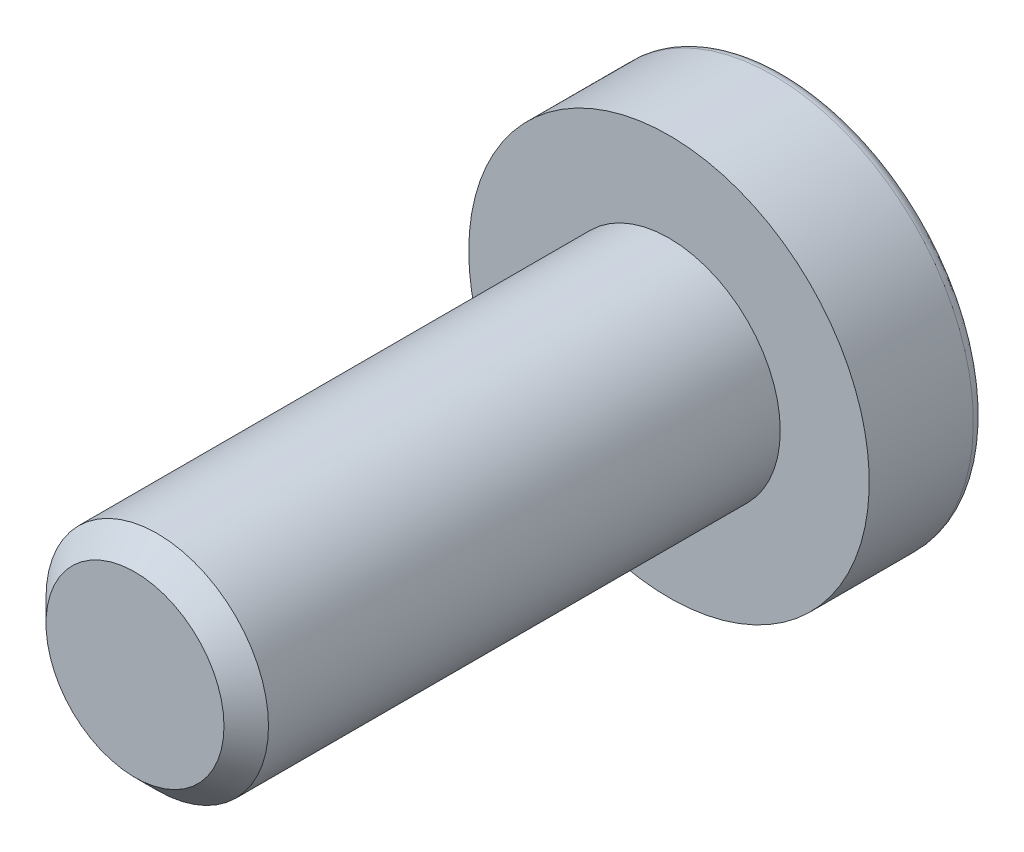
ISO-10303-21;
HEADER;
FILE_DESCRIPTION(('STEP AP214'),'2;1');
FILE_NAME('part.step','',(''),(''),'','','');
FILE_SCHEMA(('AUTOMOTIVE_DESIGN { 1 0 10303 214 1 1 1 1 }'));
ENDSEC;
DATA;
#1=APPLICATION_CONTEXT('core data for automotive mechanical design processes');
#2=APPLICATION_PROTOCOL_DEFINITION('international standard','automotive_design',2000,#1);
#3=PRODUCT_CONTEXT('',#1,'mechanical');
#4=PRODUCT('Part','Part','',(#3));
#5=PRODUCT_RELATED_PRODUCT_CATEGORY('part','',(#4));
#6=PRODUCT_DEFINITION_FORMATION('','',#4);
#7=PRODUCT_DEFINITION_CONTEXT('part definition',#1,'design');
#8=PRODUCT_DEFINITION('design','',#6,#7);
#9=PRODUCT_DEFINITION_SHAPE('','',#8);
#10=(LENGTH_UNIT() NAMED_UNIT(*) SI_UNIT(.MILLI.,.METRE.));
#11=(NAMED_UNIT(*) PLANE_ANGLE_UNIT() SI_UNIT($,.RADIAN.));
#12=(NAMED_UNIT(*) SI_UNIT($,.STERADIAN.) SOLID_ANGLE_UNIT());
#13=UNCERTAINTY_MEASURE_WITH_UNIT(LENGTH_MEASURE(1.E-05),#10,'distance_accuracy_value','');
#14=(GEOMETRIC_REPRESENTATION_CONTEXT(3) GLOBAL_UNCERTAINTY_ASSIGNED_CONTEXT((#13)) GLOBAL_UNIT_ASSIGNED_CONTEXT((#10,
#11,#12)) REPRESENTATION_CONTEXT('',''));
#15=CARTESIAN_POINT('',(0.,0.,0.));
#16=DIRECTION('',(0.,0.,1.));
#17=DIRECTION('',(1.,0.,0.));
#18=AXIS2_PLACEMENT_3D('',#15,#16,#17);
#19=CARTESIAN_POINT('',(0.,0.,-1.3));
#20=DIRECTION('',(0.,0.,1.));
#21=DIRECTION('',(1.,0.,0.));
#22=AXIS2_PLACEMENT_3D('',#19,#20,#21);
#23=PLANE('',#22);
#24=CARTESIAN_POINT('',(0.,0.,-1.3));
#25=DIRECTION('',(0.,0.,-1.));
#26=DIRECTION('',(-1.,0.,0.));
#27=AXIS2_PLACEMENT_3D('',#24,#25,#26);
#28=CIRCLE('',#27,2.12);
#29=CARTESIAN_POINT('',(-2.12,0.,-1.3));
#30=VERTEX_POINT('',#29);
#31=EDGE_CURVE('E149',#30,#30,#28,.T.);
#32=ORIENTED_EDGE('',*,*,#31,.T.);
#33=EDGE_LOOP('',(#32));
#34=FACE_BOUND('',#33,.T.);
#35=DIRECTION('',(-0.866025403784443,0.499999999999993,0.));
#36=VECTOR('',#35,1.);
#37=CARTESIAN_POINT('',(0.,1.15470053837925,-1.3));
#38=LINE('',#37,#36);
#39=CARTESIAN_POINT('',(1.,0.577350269189637,-1.3));
#40=VERTEX_POINT('',#39);
#41=CARTESIAN_POINT('',(0.,1.15470053837925,-1.3));
#42=VERTEX_POINT('',#41);
#43=EDGE_CURVE('E51',#40,#42,#38,.T.);
#44=ORIENTED_EDGE('',*,*,#43,.T.);
#45=DIRECTION('',(-0.866025403784438,-0.5,0.));
#46=VECTOR('',#45,1.);
#47=CARTESIAN_POINT('',(0.,1.15470053837925,-1.3));
#48=LINE('',#47,#46);
#49=CARTESIAN_POINT('',(-1.,0.577350269189626,-1.3));
#50=VERTEX_POINT('',#49);
#51=EDGE_CURVE('E122',#42,#50,#48,.T.);
#52=ORIENTED_EDGE('',*,*,#51,.T.);
#53=DIRECTION('',(0.,-1.,0.));
#54=VECTOR('',#53,1.);
#55=CARTESIAN_POINT('',(-1.,-0.577350269189626,-1.3));
#56=LINE('',#55,#54);
#57=CARTESIAN_POINT('',(-1.,-0.577350269189626,-1.3));
#58=VERTEX_POINT('',#57);
#59=EDGE_CURVE('E126',#50,#58,#56,.T.);
#60=ORIENTED_EDGE('',*,*,#59,.T.);
#61=DIRECTION('',(0.866025403784438,-0.5,0.));
#62=VECTOR('',#61,1.);
#63=CARTESIAN_POINT('',(0.,-1.15470053837925,-1.3));
#64=LINE('',#63,#62);
#65=CARTESIAN_POINT('',(0.,-1.15470053837925,-1.3));
#66=VERTEX_POINT('',#65);
#67=EDGE_CURVE('E129',#58,#66,#64,.T.);
#68=ORIENTED_EDGE('',*,*,#67,.T.);
#69=DIRECTION('',(0.866025403784439,0.5,0.));
#70=VECTOR('',#69,1.);
#71=CARTESIAN_POINT('',(0.,-1.15470053837925,-1.3));
#72=LINE('',#71,#70);
#73=CARTESIAN_POINT('',(1.,-0.577350269189626,-1.3));
#74=VERTEX_POINT('',#73);
#75=EDGE_CURVE('E112',#66,#74,#72,.T.);
#76=ORIENTED_EDGE('',*,*,#75,.T.);
#77=DIRECTION('',(0.,1.,0.));
#78=VECTOR('',#77,1.);
#79=CARTESIAN_POINT('',(1.,-0.577350269189626,-1.3));
#80=LINE('',#79,#78);
#81=EDGE_CURVE('E132',#74,#40,#80,.T.);
#82=ORIENTED_EDGE('',*,*,#81,.T.);
#83=EDGE_LOOP('',(#44,#52,#60,#68,#76,#82));
#84=FACE_BOUND('',#83,.T.);
#85=ADVANCED_FACE('F36',(#34,#84),#23,.F.);
#86=CARTESIAN_POINT('',(0.,0.,-1.17));
#87=DIRECTION('',(0.,0.,-1.));
#88=DIRECTION('',(-1.,0.,0.));
#89=AXIS2_PLACEMENT_3D('',#86,#87,#88);
#90=TOROIDAL_SURFACE('',#89,2.12,0.13);
#91=ORIENTED_EDGE('',*,*,#31,.F.);
#92=EDGE_LOOP('',(#91));
#93=FACE_BOUND('',#92,.T.);
#94=CARTESIAN_POINT('',(0.,0.,-1.17));
#95=DIRECTION('',(0.,0.,-1.));
#96=DIRECTION('',(-1.,0.,0.));
#97=AXIS2_PLACEMENT_3D('',#94,#95,#96);
#98=CIRCLE('',#97,2.25);
#99=CARTESIAN_POINT('',(-2.25,0.,-1.17));
#100=VERTEX_POINT('',#99);
#101=EDGE_CURVE('E146',#100,#100,#98,.T.);
#102=ORIENTED_EDGE('',*,*,#101,.T.);
#103=EDGE_LOOP('',(#102));
#104=FACE_BOUND('',#103,.T.);
#105=ADVANCED_FACE('F166',(#93,#104),#90,.T.);
#106=CARTESIAN_POINT('',(0.,0.,0.));
#107=DIRECTION('',(0.,0.,-1.));
#108=DIRECTION('',(-1.,0.,0.));
#109=AXIS2_PLACEMENT_3D('',#106,#107,#108);
#110=CYLINDRICAL_SURFACE('',#109,2.25);
#111=ORIENTED_EDGE('',*,*,#101,.F.);
#112=EDGE_LOOP('',(#111));
#113=FACE_BOUND('',#112,.T.);
#114=CARTESIAN_POINT('',(0.,0.,0.));
#115=DIRECTION('',(0.,0.,-1.));
#116=DIRECTION('',(-1.,0.,0.));
#117=AXIS2_PLACEMENT_3D('',#114,#115,#116);
#118=CIRCLE('',#117,2.25);
#119=CARTESIAN_POINT('',(-2.25,0.,0.));
#120=VERTEX_POINT('',#119);
#121=EDGE_CURVE('E143',#120,#120,#118,.T.);
#122=ORIENTED_EDGE('',*,*,#121,.T.);
#123=EDGE_LOOP('',(#122));
#124=FACE_BOUND('',#123,.T.);
#125=ADVANCED_FACE('F171',(#113,#124),#110,.T.);
#126=CARTESIAN_POINT('',(0.,0.,0.));
#127=DIRECTION('',(0.,0.,-1.));
#128=DIRECTION('',(-1.,0.,0.));
#129=AXIS2_PLACEMENT_3D('',#126,#127,#128);
#130=PLANE('',#129);
#131=CARTESIAN_POINT('',(0.,0.,0.));
#132=DIRECTION('',(0.,0.,1.));
#133=DIRECTION('',(1.,0.,0.));
#134=AXIS2_PLACEMENT_3D('',#131,#132,#133);
#135=CIRCLE('',#134,1.25);
#136=CARTESIAN_POINT('',(1.25,0.,0.));
#137=VERTEX_POINT('',#136);
#138=EDGE_CURVE('E123',#137,#137,#135,.T.);
#139=ORIENTED_EDGE('',*,*,#138,.F.);
#140=EDGE_LOOP('',(#139));
#141=FACE_BOUND('',#140,.T.);
#142=ORIENTED_EDGE('',*,*,#121,.F.);
#143=EDGE_LOOP('',(#142));
#144=FACE_BOUND('',#143,.T.);
#145=ADVANCED_FACE('F178',(#141,#144),#130,.F.);
#146=CARTESIAN_POINT('',(0.,1.15470053837925,-0.2));
#147=DIRECTION('',(-0.499999999999993,-0.866025403784443,0.));
#148=DIRECTION('',(0.866025403784443,-0.499999999999993,0.));
#149=AXIS2_PLACEMENT_3D('',#146,#147,#148);
#150=PLANE('',#149);
#151=ORIENTED_EDGE('',*,*,#43,.F.);
#152=DIRECTION('',(0.,0.,-1.));
#153=VECTOR('',#152,1.);
#154=CARTESIAN_POINT('',(1.,0.577350269189637,-0.2));
#155=LINE('',#154,#153);
#156=CARTESIAN_POINT('',(1.,0.577350269189637,-0.2));
#157=VERTEX_POINT('',#156);
#158=EDGE_CURVE('E117',#157,#40,#155,.T.);
#159=ORIENTED_EDGE('',*,*,#158,.F.);
#160=DIRECTION('',(-0.866025403784443,0.499999999999993,0.));
#161=VECTOR('',#160,1.);
#162=CARTESIAN_POINT('',(0.,1.15470053837925,-0.2));
#163=LINE('',#162,#161);
#164=CARTESIAN_POINT('',(0.,1.15470053837925,-0.2));
#165=VERTEX_POINT('',#164);
#166=EDGE_CURVE('E135',#157,#165,#163,.T.);
#167=ORIENTED_EDGE('',*,*,#166,.T.);
#168=DIRECTION('',(0.,0.,-1.));
#169=VECTOR('',#168,1.);
#170=CARTESIAN_POINT('',(0.,1.15470053837925,-0.2));
#171=LINE('',#170,#169);
#172=EDGE_CURVE('E141',#165,#42,#171,.T.);
#173=ORIENTED_EDGE('',*,*,#172,.T.);
#174=EDGE_LOOP('',(#151,#159,#167,#173));
#175=FACE_BOUND('',#174,.T.);
#176=ADVANCED_FACE('F182',(#175),#150,.T.);
#177=CARTESIAN_POINT('',(0.,1.15470053837925,-0.2));
#178=DIRECTION('',(0.5,-0.866025403784438,0.));
#179=DIRECTION('',(0.866025403784438,0.5,0.));
#180=AXIS2_PLACEMENT_3D('',#177,#178,#179);
#181=PLANE('',#180);
#182=ORIENTED_EDGE('',*,*,#51,.F.);
#183=ORIENTED_EDGE('',*,*,#172,.F.);
#184=DIRECTION('',(-0.866025403784438,-0.5,0.));
#185=VECTOR('',#184,1.);
#186=CARTESIAN_POINT('',(0.,1.15470053837925,-0.2));
#187=LINE('',#186,#185);
#188=CARTESIAN_POINT('',(-1.,0.577350269189626,-0.2));
#189=VERTEX_POINT('',#188);
#190=EDGE_CURVE('E90',#165,#189,#187,.T.);
#191=ORIENTED_EDGE('',*,*,#190,.T.);
#192=DIRECTION('',(0.,0.,-1.));
#193=VECTOR('',#192,1.);
#194=CARTESIAN_POINT('',(-1.,0.577350269189626,-0.2));
#195=LINE('',#194,#193);
#196=EDGE_CURVE('E139',#189,#50,#195,.T.);
#197=ORIENTED_EDGE('',*,*,#196,.T.);
#198=EDGE_LOOP('',(#182,#183,#191,#197));
#199=FACE_BOUND('',#198,.T.);
#200=ADVANCED_FACE('F186',(#199),#181,.T.);
#201=CARTESIAN_POINT('',(-1.,-0.577350269189626,-0.2));
#202=DIRECTION('',(1.,0.,0.));
#203=DIRECTION('',(0.,0.,-1.));
#204=AXIS2_PLACEMENT_3D('',#201,#202,#203);
#205=PLANE('',#204);
#206=ORIENTED_EDGE('',*,*,#59,.F.);
#207=ORIENTED_EDGE('',*,*,#196,.F.);
#208=DIRECTION('',(0.,-1.,0.));
#209=VECTOR('',#208,1.);
#210=CARTESIAN_POINT('',(-1.,-0.577350269189626,-0.2));
#211=LINE('',#210,#209);
#212=CARTESIAN_POINT('',(-1.,-0.577350269189626,-0.2));
#213=VERTEX_POINT('',#212);
#214=EDGE_CURVE('E108',#189,#213,#211,.T.);
#215=ORIENTED_EDGE('',*,*,#214,.T.);
#216=DIRECTION('',(0.,0.,-1.));
#217=VECTOR('',#216,1.);
#218=CARTESIAN_POINT('',(-1.,-0.577350269189626,-0.2));
#219=LINE('',#218,#217);
#220=EDGE_CURVE('E105',#213,#58,#219,.T.);
#221=ORIENTED_EDGE('',*,*,#220,.T.);
#222=EDGE_LOOP('',(#206,#207,#215,#221));
#223=FACE_BOUND('',#222,.T.);
#224=ADVANCED_FACE('F189',(#223),#205,.T.);
#225=CARTESIAN_POINT('',(0.,-1.15470053837925,-0.2));
#226=DIRECTION('',(0.5,0.866025403784438,0.));
#227=DIRECTION('',(-0.866025403784438,0.5,0.));
#228=AXIS2_PLACEMENT_3D('',#225,#226,#227);
#229=PLANE('',#228);
#230=ORIENTED_EDGE('',*,*,#67,.F.);
#231=ORIENTED_EDGE('',*,*,#220,.F.);
#232=DIRECTION('',(0.866025403784438,-0.5,0.));
#233=VECTOR('',#232,1.);
#234=CARTESIAN_POINT('',(0.,-1.15470053837925,-0.2));
#235=LINE('',#234,#233);
#236=CARTESIAN_POINT('',(0.,-1.15470053837925,-0.2));
#237=VERTEX_POINT('',#236);
#238=EDGE_CURVE('E100',#213,#237,#235,.T.);
#239=ORIENTED_EDGE('',*,*,#238,.T.);
#240=DIRECTION('',(0.,0.,-1.));
#241=VECTOR('',#240,1.);
#242=CARTESIAN_POINT('',(0.,-1.15470053837925,-0.2));
#243=LINE('',#242,#241);
#244=EDGE_CURVE('E104',#237,#66,#243,.T.);
#245=ORIENTED_EDGE('',*,*,#244,.T.);
#246=EDGE_LOOP('',(#230,#231,#239,#245));
#247=FACE_BOUND('',#246,.T.);
#248=ADVANCED_FACE('F103',(#247),#229,.T.);
#249=CARTESIAN_POINT('',(0.,-1.15470053837925,-0.2));
#250=DIRECTION('',(-0.5,0.866025403784438,0.));
#251=DIRECTION('',(-0.866025403784439,-0.5,0.));
#252=AXIS2_PLACEMENT_3D('',#249,#250,#251);
#253=PLANE('',#252);
#254=ORIENTED_EDGE('',*,*,#75,.F.);
#255=ORIENTED_EDGE('',*,*,#244,.F.);
#256=DIRECTION('',(0.866025403784439,0.5,0.));
#257=VECTOR('',#256,1.);
#258=CARTESIAN_POINT('',(0.,-1.15470053837925,-0.2));
#259=LINE('',#258,#257);
#260=CARTESIAN_POINT('',(1.,-0.577350269189626,-0.2));
#261=VERTEX_POINT('',#260);
#262=EDGE_CURVE('E107',#237,#261,#259,.T.);
#263=ORIENTED_EDGE('',*,*,#262,.T.);
#264=DIRECTION('',(0.,0.,-1.));
#265=VECTOR('',#264,1.);
#266=CARTESIAN_POINT('',(1.,-0.577350269189626,-0.2));
#267=LINE('',#266,#265);
#268=EDGE_CURVE('E81',#261,#74,#267,.T.);
#269=ORIENTED_EDGE('',*,*,#268,.T.);
#270=EDGE_LOOP('',(#254,#255,#263,#269));
#271=FACE_BOUND('',#270,.T.);
#272=ADVANCED_FACE('F110',(#271),#253,.T.);
#273=CARTESIAN_POINT('',(1.,-0.577350269189626,-0.2));
#274=DIRECTION('',(-1.,0.,0.));
#275=DIRECTION('',(0.,-1.,0.));
#276=AXIS2_PLACEMENT_3D('',#273,#274,#275);
#277=PLANE('',#276);
#278=ORIENTED_EDGE('',*,*,#81,.F.);
#279=ORIENTED_EDGE('',*,*,#268,.F.);
#280=DIRECTION('',(0.,1.,0.));
#281=VECTOR('',#280,1.);
#282=CARTESIAN_POINT('',(1.,-0.577350269189626,-0.2));
#283=LINE('',#282,#281);
#284=EDGE_CURVE('E59',#261,#157,#283,.T.);
#285=ORIENTED_EDGE('',*,*,#284,.T.);
#286=ORIENTED_EDGE('',*,*,#158,.T.);
#287=EDGE_LOOP('',(#278,#279,#285,#286));
#288=FACE_BOUND('',#287,.T.);
#289=ADVANCED_FACE('F198',(#288),#277,.T.);
#290=CARTESIAN_POINT('',(-1.,1.73205080756887,-0.2));
#291=DIRECTION('',(0.,0.,1.));
#292=DIRECTION('',(1.,0.,0.));
#293=AXIS2_PLACEMENT_3D('',#290,#291,#292);
#294=PLANE('',#293);
#295=ORIENTED_EDGE('',*,*,#166,.F.);
#296=ORIENTED_EDGE('',*,*,#284,.F.);
#297=ORIENTED_EDGE('',*,*,#262,.F.);
#298=ORIENTED_EDGE('',*,*,#238,.F.);
#299=ORIENTED_EDGE('',*,*,#214,.F.);
#300=ORIENTED_EDGE('',*,*,#190,.F.);
#301=EDGE_LOOP('',(#295,#296,#297,#298,#299,#300));
#302=FACE_BOUND('',#301,.T.);
#303=ADVANCED_FACE('F115',(#302),#294,.F.);
#304=CARTESIAN_POINT('',(0.,0.,6.));
#305=DIRECTION('',(0.,0.,1.));
#306=DIRECTION('',(1.,0.,0.));
#307=AXIS2_PLACEMENT_3D('',#304,#305,#306);
#308=PLANE('',#307);
#309=CARTESIAN_POINT('',(0.,0.,6.));
#310=DIRECTION('',(0.,0.,1.));
#311=DIRECTION('',(1.,0.,0.));
#312=AXIS2_PLACEMENT_3D('',#309,#310,#311);
#313=CIRCLE('',#312,1.);
#314=CARTESIAN_POINT('',(1.,0.,6.));
#315=VERTEX_POINT('',#314);
#316=EDGE_CURVE('E44',#315,#315,#313,.T.);
#317=ORIENTED_EDGE('',*,*,#316,.T.);
#318=EDGE_LOOP('',(#317));
#319=FACE_BOUND('',#318,.T.);
#320=ADVANCED_FACE('F154',(#319),#308,.T.);
#321=CARTESIAN_POINT('',(0.,0.,0.));
#322=DIRECTION('',(0.,0.,1.));
#323=DIRECTION('',(1.,0.,0.));
#324=AXIS2_PLACEMENT_3D('',#321,#322,#323);
#325=CYLINDRICAL_SURFACE('',#324,1.25);
#326=CARTESIAN_POINT('',(0.,0.,5.75));
#327=DIRECTION('',(0.,0.,1.));
#328=DIRECTION('',(1.,0.,0.));
#329=AXIS2_PLACEMENT_3D('',#326,#327,#328);
#330=CIRCLE('',#329,1.25);
#331=CARTESIAN_POINT('',(1.25,0.,5.75));
#332=VERTEX_POINT('',#331);
#333=EDGE_CURVE('E11',#332,#332,#330,.F.);
#334=ORIENTED_EDGE('',*,*,#333,.T.);
#335=EDGE_LOOP('',(#334));
#336=FACE_BOUND('',#335,.T.);
#337=ORIENTED_EDGE('',*,*,#138,.T.);
#338=EDGE_LOOP('',(#337));
#339=FACE_BOUND('',#338,.T.);
#340=ADVANCED_FACE('F157',(#336,#339),#325,.T.);
#341=CARTESIAN_POINT('',(0.,0.,6.));
#342=DIRECTION('',(0.,0.,-1.));
#343=DIRECTION('',(-1.,0.,0.));
#344=AXIS2_PLACEMENT_3D('',#341,#342,#343);
#345=CONICAL_SURFACE('',#344,1.,0.785398163397447);
#346=ORIENTED_EDGE('',*,*,#333,.F.);
#347=EDGE_LOOP('',(#346));
#348=FACE_BOUND('',#347,.T.);
#349=ORIENTED_EDGE('',*,*,#316,.F.);
#350=EDGE_LOOP('',(#349));
#351=FACE_BOUND('',#350,.T.);
#352=ADVANCED_FACE('F38',(#348,#351),#345,.T.);
#353=CLOSED_SHELL('',(#85,#105,#125,#145,#176,#200,#224,#248,#272,#289,#303,#320,#340,#352));
#354=MANIFOLD_SOLID_BREP('B2',#353);
#355=ADVANCED_BREP_SHAPE_REPRESENTATION('',(#18,#354),#14);
#356=SHAPE_DEFINITION_REPRESENTATION(#9,#355);
ENDSEC;
END-ISO-10303-21;
